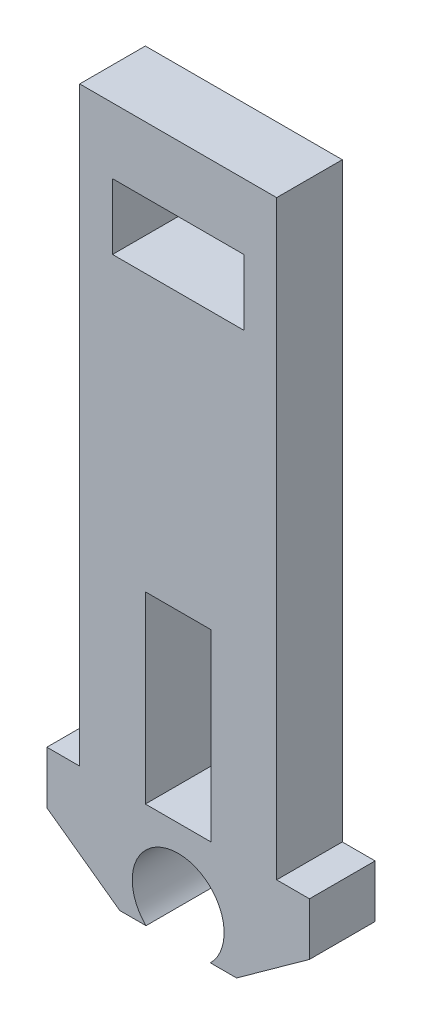
ISO-10303-21;
HEADER;
FILE_DESCRIPTION(('STEP AP214'),'2;1');
FILE_NAME('part.step','',(''),(''),'','','');
FILE_SCHEMA(('AUTOMOTIVE_DESIGN { 1 0 10303 214 1 1 1 1 }'));
ENDSEC;
DATA;
#1=APPLICATION_CONTEXT('core data for automotive mechanical design processes');
#2=APPLICATION_PROTOCOL_DEFINITION('international standard','automotive_design',2000,#1);
#3=PRODUCT_CONTEXT('',#1,'mechanical');
#4=PRODUCT('Part','Part','',(#3));
#5=PRODUCT_RELATED_PRODUCT_CATEGORY('part','',(#4));
#6=PRODUCT_DEFINITION_FORMATION('','',#4);
#7=PRODUCT_DEFINITION_CONTEXT('part definition',#1,'design');
#8=PRODUCT_DEFINITION('design','',#6,#7);
#9=PRODUCT_DEFINITION_SHAPE('','',#8);
#10=(LENGTH_UNIT() NAMED_UNIT(*) SI_UNIT(.MILLI.,.METRE.));
#11=(NAMED_UNIT(*) PLANE_ANGLE_UNIT() SI_UNIT($,.RADIAN.));
#12=(NAMED_UNIT(*) SI_UNIT($,.STERADIAN.) SOLID_ANGLE_UNIT());
#13=UNCERTAINTY_MEASURE_WITH_UNIT(LENGTH_MEASURE(1.E-05),#10,'distance_accuracy_value','');
#14=(GEOMETRIC_REPRESENTATION_CONTEXT(3) GLOBAL_UNCERTAINTY_ASSIGNED_CONTEXT((#13)) GLOBAL_UNIT_ASSIGNED_CONTEXT((#10,
#11,#12)) REPRESENTATION_CONTEXT('',''));
#15=CARTESIAN_POINT('',(0.,0.,0.));
#16=DIRECTION('',(0.,0.,1.));
#17=DIRECTION('',(1.,0.,0.));
#18=AXIS2_PLACEMENT_3D('',#15,#16,#17);
#19=CARTESIAN_POINT('',(9.44948974278318,2.5,5.));
#20=DIRECTION('',(0.,0.,1.));
#21=DIRECTION('',(1.,0.,0.));
#22=AXIS2_PLACEMENT_3D('',#19,#20,#21);
#23=PLANE('',#22);
#24=CARTESIAN_POINT('',(9.44948974278318,2.5,5.));
#25=DIRECTION('',(0.,0.,-1.));
#26=DIRECTION('',(1.,0.,0.));
#27=AXIS2_PLACEMENT_3D('',#24,#25,#26);
#28=CIRCLE('',#27,3.5);
#29=CARTESIAN_POINT('',(7.,0.,5.));
#30=VERTEX_POINT('',#29);
#31=CARTESIAN_POINT('',(11.8989794855664,0.,5.));
#32=VERTEX_POINT('',#31);
#33=EDGE_CURVE('E239',#30,#32,#28,.T.);
#34=ORIENTED_EDGE('',*,*,#33,.T.);
#35=DIRECTION('',(1.,0.,0.));
#36=VECTOR('',#35,1.);
#37=CARTESIAN_POINT('',(11.8989794855664,0.,5.));
#38=LINE('',#37,#36);
#39=CARTESIAN_POINT('',(13.8989794855664,0.,5.));
#40=VERTEX_POINT('',#39);
#41=EDGE_CURVE('E242',#32,#40,#38,.T.);
#42=ORIENTED_EDGE('',*,*,#41,.T.);
#43=DIRECTION('',(0.811282495612526,0.584654352855353,0.));
#44=VECTOR('',#43,1.);
#45=CARTESIAN_POINT('',(13.8989794855664,0.,5.));
#46=LINE('',#45,#44);
#47=CARTESIAN_POINT('',(19.4494897427832,4.,5.));
#48=VERTEX_POINT('',#47);
#49=EDGE_CURVE('E245',#40,#48,#46,.T.);
#50=ORIENTED_EDGE('',*,*,#49,.T.);
#51=DIRECTION('',(0.,1.,0.));
#52=VECTOR('',#51,1.);
#53=CARTESIAN_POINT('',(19.4494897427832,4.,5.));
#54=LINE('',#53,#52);
#55=CARTESIAN_POINT('',(19.4494897427832,7.99999999999999,5.));
#56=VERTEX_POINT('',#55);
#57=EDGE_CURVE('E247',#48,#56,#54,.T.);
#58=ORIENTED_EDGE('',*,*,#57,.T.);
#59=DIRECTION('',(-1.,0.,0.));
#60=VECTOR('',#59,1.);
#61=CARTESIAN_POINT('',(16.9494897427832,7.99999999999999,5.));
#62=LINE('',#61,#60);
#63=CARTESIAN_POINT('',(16.9494897427832,7.99999999999999,5.));
#64=VERTEX_POINT('',#63);
#65=EDGE_CURVE('E249',#56,#64,#62,.T.);
#66=ORIENTED_EDGE('',*,*,#65,.T.);
#67=DIRECTION('',(0.,1.,0.));
#68=VECTOR('',#67,1.);
#69=CARTESIAN_POINT('',(16.9494897427832,7.99999999999999,5.));
#70=LINE('',#69,#68);
#71=CARTESIAN_POINT('',(16.9494897427832,53.,5.));
#72=VERTEX_POINT('',#71);
#73=EDGE_CURVE('E251',#64,#72,#70,.T.);
#74=ORIENTED_EDGE('',*,*,#73,.T.);
#75=DIRECTION('',(-1.,0.,0.));
#76=VECTOR('',#75,1.);
#77=CARTESIAN_POINT('',(1.94948974278318,53.,5.));
#78=LINE('',#77,#76);
#79=CARTESIAN_POINT('',(1.94948974278318,53.,5.));
#80=VERTEX_POINT('',#79);
#81=EDGE_CURVE('E253',#72,#80,#78,.T.);
#82=ORIENTED_EDGE('',*,*,#81,.T.);
#83=DIRECTION('',(0.,-1.,0.));
#84=VECTOR('',#83,1.);
#85=CARTESIAN_POINT('',(1.94948974278318,7.99999999999999,5.));
#86=LINE('',#85,#84);
#87=CARTESIAN_POINT('',(1.94948974278318,7.99999999999999,5.));
#88=VERTEX_POINT('',#87);
#89=EDGE_CURVE('E255',#80,#88,#86,.T.);
#90=ORIENTED_EDGE('',*,*,#89,.T.);
#91=DIRECTION('',(-1.,0.,0.));
#92=VECTOR('',#91,1.);
#93=CARTESIAN_POINT('',(-0.550510257216824,7.99999999999999,5.));
#94=LINE('',#93,#92);
#95=CARTESIAN_POINT('',(-0.550510257216824,7.99999999999999,5.));
#96=VERTEX_POINT('',#95);
#97=EDGE_CURVE('E257',#88,#96,#94,.T.);
#98=ORIENTED_EDGE('',*,*,#97,.T.);
#99=DIRECTION('',(0.,-1.,0.));
#100=VECTOR('',#99,1.);
#101=CARTESIAN_POINT('',(-0.550510257216824,4.,5.));
#102=LINE('',#101,#100);
#103=CARTESIAN_POINT('',(-0.550510257216824,4.,5.));
#104=VERTEX_POINT('',#103);
#105=EDGE_CURVE('E259',#96,#104,#102,.T.);
#106=ORIENTED_EDGE('',*,*,#105,.T.);
#107=DIRECTION('',(0.811282495612526,-0.584654352855353,0.));
#108=VECTOR('',#107,1.);
#109=CARTESIAN_POINT('',(5.,0.,5.));
#110=LINE('',#109,#108);
#111=CARTESIAN_POINT('',(5.,0.,5.));
#112=VERTEX_POINT('',#111);
#113=EDGE_CURVE('E261',#104,#112,#110,.T.);
#114=ORIENTED_EDGE('',*,*,#113,.T.);
#115=DIRECTION('',(1.,0.,0.));
#116=VECTOR('',#115,1.);
#117=CARTESIAN_POINT('',(5.,0.,5.));
#118=LINE('',#117,#116);
#119=EDGE_CURVE('E263',#112,#30,#118,.T.);
#120=ORIENTED_EDGE('',*,*,#119,.T.);
#121=EDGE_LOOP('',(#34,#42,#50,#58,#66,#74,#82,#90,#98,#106,#114,#120));
#122=FACE_BOUND('',#121,.T.);
#123=DIRECTION('',(1.,0.,0.));
#124=VECTOR('',#123,1.);
#125=CARTESIAN_POINT('',(4.44948974278318,43.,5.));
#126=LINE('',#125,#124);
#127=CARTESIAN_POINT('',(4.44948974278318,43.,5.));
#128=VERTEX_POINT('',#127);
#129=CARTESIAN_POINT('',(14.4494897427832,43.,5.));
#130=VERTEX_POINT('',#129);
#131=EDGE_CURVE('E210',#128,#130,#126,.T.);
#132=ORIENTED_EDGE('',*,*,#131,.F.);
#133=DIRECTION('',(0.,-1.,0.));
#134=VECTOR('',#133,1.);
#135=CARTESIAN_POINT('',(4.44948974278318,48.,5.));
#136=LINE('',#135,#134);
#137=CARTESIAN_POINT('',(4.44948974278318,48.,5.));
#138=VERTEX_POINT('',#137);
#139=EDGE_CURVE('E208',#138,#128,#136,.T.);
#140=ORIENTED_EDGE('',*,*,#139,.F.);
#141=DIRECTION('',(-1.,0.,0.));
#142=VECTOR('',#141,1.);
#143=CARTESIAN_POINT('',(4.44948974278318,48.,5.));
#144=LINE('',#143,#142);
#145=CARTESIAN_POINT('',(14.4494897427832,48.,5.));
#146=VERTEX_POINT('',#145);
#147=EDGE_CURVE('E216',#146,#138,#144,.T.);
#148=ORIENTED_EDGE('',*,*,#147,.F.);
#149=DIRECTION('',(0.,1.,0.));
#150=VECTOR('',#149,1.);
#151=CARTESIAN_POINT('',(14.4494897427832,48.,5.));
#152=LINE('',#151,#150);
#153=EDGE_CURVE('E213',#130,#146,#152,.T.);
#154=ORIENTED_EDGE('',*,*,#153,.F.);
#155=EDGE_LOOP('',(#132,#140,#148,#154));
#156=FACE_BOUND('',#155,.T.);
#157=DIRECTION('',(1.,0.,0.));
#158=VECTOR('',#157,1.);
#159=CARTESIAN_POINT('',(6.94948974278318,7.99999999999999,5.));
#160=LINE('',#159,#158);
#161=CARTESIAN_POINT('',(6.94948974278318,7.99999999999999,5.));
#162=VERTEX_POINT('',#161);
#163=CARTESIAN_POINT('',(11.9494897427832,7.99999999999999,5.));
#164=VERTEX_POINT('',#163);
#165=EDGE_CURVE('E180',#162,#164,#160,.T.);
#166=ORIENTED_EDGE('',*,*,#165,.F.);
#167=DIRECTION('',(0.,-1.,0.));
#168=VECTOR('',#167,1.);
#169=CARTESIAN_POINT('',(6.94948974278318,22.,5.));
#170=LINE('',#169,#168);
#171=CARTESIAN_POINT('',(6.94948974278318,22.,5.));
#172=VERTEX_POINT('',#171);
#173=EDGE_CURVE('E172',#172,#162,#170,.T.);
#174=ORIENTED_EDGE('',*,*,#173,.F.);
#175=DIRECTION('',(-1.,0.,0.));
#176=VECTOR('',#175,1.);
#177=CARTESIAN_POINT('',(11.9494897427832,22.,5.));
#178=LINE('',#177,#176);
#179=CARTESIAN_POINT('',(11.9494897427832,22.,5.));
#180=VERTEX_POINT('',#179);
#181=EDGE_CURVE('E194',#180,#172,#178,.T.);
#182=ORIENTED_EDGE('',*,*,#181,.F.);
#183=DIRECTION('',(0.,1.,0.));
#184=VECTOR('',#183,1.);
#185=CARTESIAN_POINT('',(11.9494897427832,7.99999999999999,5.));
#186=LINE('',#185,#184);
#187=EDGE_CURVE('E192',#164,#180,#186,.T.);
#188=ORIENTED_EDGE('',*,*,#187,.F.);
#189=EDGE_LOOP('',(#166,#174,#182,#188));
#190=FACE_BOUND('',#189,.T.);
#191=ADVANCED_FACE('F35',(#122,#156,#190),#23,.T.);
#192=CARTESIAN_POINT('',(9.44948974278318,2.5,0.));
#193=DIRECTION('',(0.,0.,1.));
#194=DIRECTION('',(1.,0.,0.));
#195=AXIS2_PLACEMENT_3D('',#192,#193,#194);
#196=PLANE('',#195);
#197=DIRECTION('',(0.,-1.,0.));
#198=VECTOR('',#197,1.);
#199=CARTESIAN_POINT('',(4.44948974278318,48.,0.));
#200=LINE('',#199,#198);
#201=CARTESIAN_POINT('',(4.44948974278318,48.,0.));
#202=VERTEX_POINT('',#201);
#203=CARTESIAN_POINT('',(4.44948974278318,43.,0.));
#204=VERTEX_POINT('',#203);
#205=EDGE_CURVE('E188',#202,#204,#200,.T.);
#206=ORIENTED_EDGE('',*,*,#205,.T.);
#207=DIRECTION('',(1.,0.,0.));
#208=VECTOR('',#207,1.);
#209=CARTESIAN_POINT('',(4.44948974278318,43.,0.));
#210=LINE('',#209,#208);
#211=CARTESIAN_POINT('',(14.4494897427832,43.,0.));
#212=VERTEX_POINT('',#211);
#213=EDGE_CURVE('E221',#204,#212,#210,.T.);
#214=ORIENTED_EDGE('',*,*,#213,.T.);
#215=DIRECTION('',(0.,1.,0.));
#216=VECTOR('',#215,1.);
#217=CARTESIAN_POINT('',(14.4494897427832,48.,0.));
#218=LINE('',#217,#216);
#219=CARTESIAN_POINT('',(14.4494897427832,48.,0.));
#220=VERTEX_POINT('',#219);
#221=EDGE_CURVE('E224',#212,#220,#218,.T.);
#222=ORIENTED_EDGE('',*,*,#221,.T.);
#223=DIRECTION('',(-1.,0.,0.));
#224=VECTOR('',#223,1.);
#225=CARTESIAN_POINT('',(4.44948974278318,48.,0.));
#226=LINE('',#225,#224);
#227=EDGE_CURVE('E211',#220,#202,#226,.T.);
#228=ORIENTED_EDGE('',*,*,#227,.T.);
#229=EDGE_LOOP('',(#206,#214,#222,#228));
#230=FACE_BOUND('',#229,.T.);
#231=CARTESIAN_POINT('',(9.44948974278318,2.5,0.));
#232=DIRECTION('',(0.,0.,-1.));
#233=DIRECTION('',(1.,0.,0.));
#234=AXIS2_PLACEMENT_3D('',#231,#232,#233);
#235=CIRCLE('',#234,3.5);
#236=CARTESIAN_POINT('',(7.,0.,0.));
#237=VERTEX_POINT('',#236);
#238=CARTESIAN_POINT('',(11.8989794855664,0.,0.));
#239=VERTEX_POINT('',#238);
#240=EDGE_CURVE('E238',#237,#239,#235,.T.);
#241=ORIENTED_EDGE('',*,*,#240,.F.);
#242=DIRECTION('',(1.,0.,0.));
#243=VECTOR('',#242,1.);
#244=CARTESIAN_POINT('',(5.,0.,0.));
#245=LINE('',#244,#243);
#246=CARTESIAN_POINT('',(5.,0.,0.));
#247=VERTEX_POINT('',#246);
#248=EDGE_CURVE('E243',#247,#237,#245,.T.);
#249=ORIENTED_EDGE('',*,*,#248,.F.);
#250=DIRECTION('',(0.811282495612526,-0.584654352855353,0.));
#251=VECTOR('',#250,1.);
#252=CARTESIAN_POINT('',(5.,0.,0.));
#253=LINE('',#252,#251);
#254=CARTESIAN_POINT('',(-0.550510257216824,4.,0.));
#255=VERTEX_POINT('',#254);
#256=EDGE_CURVE('E286',#255,#247,#253,.T.);
#257=ORIENTED_EDGE('',*,*,#256,.F.);
#258=DIRECTION('',(0.,-1.,0.));
#259=VECTOR('',#258,1.);
#260=CARTESIAN_POINT('',(-0.550510257216824,4.,0.));
#261=LINE('',#260,#259);
#262=CARTESIAN_POINT('',(-0.550510257216824,7.99999999999999,0.));
#263=VERTEX_POINT('',#262);
#264=EDGE_CURVE('E284',#263,#255,#261,.T.);
#265=ORIENTED_EDGE('',*,*,#264,.F.);
#266=DIRECTION('',(-1.,0.,0.));
#267=VECTOR('',#266,1.);
#268=CARTESIAN_POINT('',(-0.550510257216824,7.99999999999999,0.));
#269=LINE('',#268,#267);
#270=CARTESIAN_POINT('',(1.94948974278318,7.99999999999999,0.));
#271=VERTEX_POINT('',#270);
#272=EDGE_CURVE('E282',#271,#263,#269,.T.);
#273=ORIENTED_EDGE('',*,*,#272,.F.);
#274=DIRECTION('',(0.,-1.,0.));
#275=VECTOR('',#274,1.);
#276=CARTESIAN_POINT('',(1.94948974278318,7.99999999999999,0.));
#277=LINE('',#276,#275);
#278=CARTESIAN_POINT('',(1.94948974278318,53.,0.));
#279=VERTEX_POINT('',#278);
#280=EDGE_CURVE('E280',#279,#271,#277,.T.);
#281=ORIENTED_EDGE('',*,*,#280,.F.);
#282=DIRECTION('',(-1.,0.,0.));
#283=VECTOR('',#282,1.);
#284=CARTESIAN_POINT('',(1.94948974278318,53.,0.));
#285=LINE('',#284,#283);
#286=CARTESIAN_POINT('',(16.9494897427832,53.,0.));
#287=VERTEX_POINT('',#286);
#288=EDGE_CURVE('E278',#287,#279,#285,.T.);
#289=ORIENTED_EDGE('',*,*,#288,.F.);
#290=DIRECTION('',(0.,1.,0.));
#291=VECTOR('',#290,1.);
#292=CARTESIAN_POINT('',(16.9494897427832,7.99999999999999,0.));
#293=LINE('',#292,#291);
#294=CARTESIAN_POINT('',(16.9494897427832,7.99999999999999,0.));
#295=VERTEX_POINT('',#294);
#296=EDGE_CURVE('E276',#295,#287,#293,.T.);
#297=ORIENTED_EDGE('',*,*,#296,.F.);
#298=DIRECTION('',(-1.,0.,0.));
#299=VECTOR('',#298,1.);
#300=CARTESIAN_POINT('',(16.9494897427832,7.99999999999999,0.));
#301=LINE('',#300,#299);
#302=CARTESIAN_POINT('',(19.4494897427832,7.99999999999999,0.));
#303=VERTEX_POINT('',#302);
#304=EDGE_CURVE('E274',#303,#295,#301,.T.);
#305=ORIENTED_EDGE('',*,*,#304,.F.);
#306=DIRECTION('',(0.,1.,0.));
#307=VECTOR('',#306,1.);
#308=CARTESIAN_POINT('',(19.4494897427832,4.,0.));
#309=LINE('',#308,#307);
#310=CARTESIAN_POINT('',(19.4494897427832,4.,0.));
#311=VERTEX_POINT('',#310);
#312=EDGE_CURVE('E272',#311,#303,#309,.T.);
#313=ORIENTED_EDGE('',*,*,#312,.F.);
#314=DIRECTION('',(0.811282495612526,0.584654352855353,0.));
#315=VECTOR('',#314,1.);
#316=CARTESIAN_POINT('',(13.8989794855664,0.,0.));
#317=LINE('',#316,#315);
#318=CARTESIAN_POINT('',(13.8989794855664,0.,0.));
#319=VERTEX_POINT('',#318);
#320=EDGE_CURVE('E270',#319,#311,#317,.T.);
#321=ORIENTED_EDGE('',*,*,#320,.F.);
#322=DIRECTION('',(1.,0.,0.));
#323=VECTOR('',#322,1.);
#324=CARTESIAN_POINT('',(11.8989794855664,0.,0.));
#325=LINE('',#324,#323);
#326=EDGE_CURVE('E268',#239,#319,#325,.T.);
#327=ORIENTED_EDGE('',*,*,#326,.F.);
#328=EDGE_LOOP('',(#241,#249,#257,#265,#273,#281,#289,#297,#305,#313,#321,#327));
#329=FACE_BOUND('',#328,.T.);
#330=DIRECTION('',(0.,-1.,0.));
#331=VECTOR('',#330,1.);
#332=CARTESIAN_POINT('',(6.94948974278318,22.,0.));
#333=LINE('',#332,#331);
#334=CARTESIAN_POINT('',(6.94948974278318,22.,0.));
#335=VERTEX_POINT('',#334);
#336=CARTESIAN_POINT('',(6.94948974278318,7.99999999999999,0.));
#337=VERTEX_POINT('',#336);
#338=EDGE_CURVE('E58',#335,#337,#333,.T.);
#339=ORIENTED_EDGE('',*,*,#338,.T.);
#340=DIRECTION('',(1.,0.,0.));
#341=VECTOR('',#340,1.);
#342=CARTESIAN_POINT('',(6.94948974278318,7.99999999999999,0.));
#343=LINE('',#342,#341);
#344=CARTESIAN_POINT('',(11.9494897427832,7.99999999999999,0.));
#345=VERTEX_POINT('',#344);
#346=EDGE_CURVE('E187',#337,#345,#343,.T.);
#347=ORIENTED_EDGE('',*,*,#346,.T.);
#348=DIRECTION('',(0.,1.,0.));
#349=VECTOR('',#348,1.);
#350=CARTESIAN_POINT('',(11.9494897427832,7.99999999999999,0.));
#351=LINE('',#350,#349);
#352=CARTESIAN_POINT('',(11.9494897427832,22.,0.));
#353=VERTEX_POINT('',#352);
#354=EDGE_CURVE('E200',#345,#353,#351,.T.);
#355=ORIENTED_EDGE('',*,*,#354,.T.);
#356=DIRECTION('',(-1.,0.,0.));
#357=VECTOR('',#356,1.);
#358=CARTESIAN_POINT('',(11.9494897427832,22.,0.));
#359=LINE('',#358,#357);
#360=EDGE_CURVE('E181',#353,#335,#359,.T.);
#361=ORIENTED_EDGE('',*,*,#360,.T.);
#362=EDGE_LOOP('',(#339,#347,#355,#361));
#363=FACE_BOUND('',#362,.T.);
#364=ADVANCED_FACE('F328',(#230,#329,#363),#196,.F.);
#365=CARTESIAN_POINT('',(9.44948974278318,2.5,5.));
#366=DIRECTION('',(0.,0.,-1.));
#367=DIRECTION('',(-1.,0.,0.));
#368=AXIS2_PLACEMENT_3D('',#365,#366,#367);
#369=CYLINDRICAL_SURFACE('',#368,3.5);
#370=ORIENTED_EDGE('',*,*,#240,.T.);
#371=DIRECTION('',(0.,0.,-1.));
#372=VECTOR('',#371,1.);
#373=CARTESIAN_POINT('',(11.8989794855664,0.,5.));
#374=LINE('',#373,#372);
#375=EDGE_CURVE('E11',#32,#239,#374,.T.);
#376=ORIENTED_EDGE('',*,*,#375,.F.);
#377=ORIENTED_EDGE('',*,*,#33,.F.);
#378=DIRECTION('',(0.,0.,-1.));
#379=VECTOR('',#378,1.);
#380=CARTESIAN_POINT('',(7.,0.,5.));
#381=LINE('',#380,#379);
#382=EDGE_CURVE('E265',#30,#237,#381,.T.);
#383=ORIENTED_EDGE('',*,*,#382,.T.);
#384=EDGE_LOOP('',(#370,#376,#377,#383));
#385=FACE_BOUND('',#384,.T.);
#386=ADVANCED_FACE('F37',(#385),#369,.F.);
#387=CARTESIAN_POINT('',(11.8989794855664,0.,5.));
#388=DIRECTION('',(0.,1.,0.));
#389=DIRECTION('',(-1.,0.,0.));
#390=AXIS2_PLACEMENT_3D('',#387,#388,#389);
#391=PLANE('',#390);
#392=ORIENTED_EDGE('',*,*,#326,.T.);
#393=DIRECTION('',(0.,0.,-1.));
#394=VECTOR('',#393,1.);
#395=CARTESIAN_POINT('',(13.8989794855664,0.,5.));
#396=LINE('',#395,#394);
#397=EDGE_CURVE('E43',#40,#319,#396,.T.);
#398=ORIENTED_EDGE('',*,*,#397,.F.);
#399=ORIENTED_EDGE('',*,*,#41,.F.);
#400=ORIENTED_EDGE('',*,*,#375,.T.);
#401=EDGE_LOOP('',(#392,#398,#399,#400));
#402=FACE_BOUND('',#401,.T.);
#403=ADVANCED_FACE('F346',(#402),#391,.F.);
#404=CARTESIAN_POINT('',(13.8989794855664,0.,5.));
#405=DIRECTION('',(-0.584654352855353,0.811282495612526,0.));
#406=DIRECTION('',(-0.811282495612526,-0.584654352855353,0.));
#407=AXIS2_PLACEMENT_3D('',#404,#405,#406);
#408=PLANE('',#407);
#409=ORIENTED_EDGE('',*,*,#320,.T.);
#410=DIRECTION('',(0.,0.,-1.));
#411=VECTOR('',#410,1.);
#412=CARTESIAN_POINT('',(19.4494897427832,4.,5.));
#413=LINE('',#412,#411);
#414=EDGE_CURVE('E315',#48,#311,#413,.T.);
#415=ORIENTED_EDGE('',*,*,#414,.F.);
#416=ORIENTED_EDGE('',*,*,#49,.F.);
#417=ORIENTED_EDGE('',*,*,#397,.T.);
#418=EDGE_LOOP('',(#409,#415,#416,#417));
#419=FACE_BOUND('',#418,.T.);
#420=ADVANCED_FACE('F322',(#419),#408,.F.);
#421=CARTESIAN_POINT('',(19.4494897427832,4.,5.));
#422=DIRECTION('',(-1.,0.,0.));
#423=DIRECTION('',(0.,0.,1.));
#424=AXIS2_PLACEMENT_3D('',#421,#422,#423);
#425=PLANE('',#424);
#426=ORIENTED_EDGE('',*,*,#312,.T.);
#427=DIRECTION('',(0.,0.,-1.));
#428=VECTOR('',#427,1.);
#429=CARTESIAN_POINT('',(19.4494897427832,7.99999999999999,5.));
#430=LINE('',#429,#428);
#431=EDGE_CURVE('E312',#56,#303,#430,.T.);
#432=ORIENTED_EDGE('',*,*,#431,.F.);
#433=ORIENTED_EDGE('',*,*,#57,.F.);
#434=ORIENTED_EDGE('',*,*,#414,.T.);
#435=EDGE_LOOP('',(#426,#432,#433,#434));
#436=FACE_BOUND('',#435,.T.);
#437=ADVANCED_FACE('F334',(#436),#425,.F.);
#438=CARTESIAN_POINT('',(16.9494897427832,7.99999999999999,5.));
#439=DIRECTION('',(0.,-1.,0.));
#440=DIRECTION('',(0.,0.,-1.));
#441=AXIS2_PLACEMENT_3D('',#438,#439,#440);
#442=PLANE('',#441);
#443=ORIENTED_EDGE('',*,*,#304,.T.);
#444=DIRECTION('',(0.,0.,-1.));
#445=VECTOR('',#444,1.);
#446=CARTESIAN_POINT('',(16.9494897427832,7.99999999999999,5.));
#447=LINE('',#446,#445);
#448=EDGE_CURVE('E309',#64,#295,#447,.T.);
#449=ORIENTED_EDGE('',*,*,#448,.F.);
#450=ORIENTED_EDGE('',*,*,#65,.F.);
#451=ORIENTED_EDGE('',*,*,#431,.T.);
#452=EDGE_LOOP('',(#443,#449,#450,#451));
#453=FACE_BOUND('',#452,.T.);
#454=ADVANCED_FACE('F338',(#453),#442,.F.);
#455=CARTESIAN_POINT('',(16.9494897427832,7.99999999999999,5.));
#456=DIRECTION('',(-1.,0.,0.));
#457=DIRECTION('',(0.,0.,1.));
#458=AXIS2_PLACEMENT_3D('',#455,#456,#457);
#459=PLANE('',#458);
#460=ORIENTED_EDGE('',*,*,#296,.T.);
#461=DIRECTION('',(0.,0.,-1.));
#462=VECTOR('',#461,1.);
#463=CARTESIAN_POINT('',(16.9494897427832,53.,5.));
#464=LINE('',#463,#462);
#465=EDGE_CURVE('E306',#72,#287,#464,.T.);
#466=ORIENTED_EDGE('',*,*,#465,.F.);
#467=ORIENTED_EDGE('',*,*,#73,.F.);
#468=ORIENTED_EDGE('',*,*,#448,.T.);
#469=EDGE_LOOP('',(#460,#466,#467,#468));
#470=FACE_BOUND('',#469,.T.);
#471=ADVANCED_FACE('F379',(#470),#459,.F.);
#472=CARTESIAN_POINT('',(1.94948974278318,53.,5.));
#473=DIRECTION('',(0.,-1.,0.));
#474=DIRECTION('',(0.,0.,-1.));
#475=AXIS2_PLACEMENT_3D('',#472,#473,#474);
#476=PLANE('',#475);
#477=ORIENTED_EDGE('',*,*,#288,.T.);
#478=DIRECTION('',(0.,0.,-1.));
#479=VECTOR('',#478,1.);
#480=CARTESIAN_POINT('',(1.94948974278318,53.,5.));
#481=LINE('',#480,#479);
#482=EDGE_CURVE('E303',#80,#279,#481,.T.);
#483=ORIENTED_EDGE('',*,*,#482,.F.);
#484=ORIENTED_EDGE('',*,*,#81,.F.);
#485=ORIENTED_EDGE('',*,*,#465,.T.);
#486=EDGE_LOOP('',(#477,#483,#484,#485));
#487=FACE_BOUND('',#486,.T.);
#488=ADVANCED_FACE('F377',(#487),#476,.F.);
#489=CARTESIAN_POINT('',(1.94948974278318,7.99999999999999,5.));
#490=DIRECTION('',(1.,0.,0.));
#491=DIRECTION('',(0.,0.,-1.));
#492=AXIS2_PLACEMENT_3D('',#489,#490,#491);
#493=PLANE('',#492);
#494=ORIENTED_EDGE('',*,*,#280,.T.);
#495=DIRECTION('',(0.,0.,-1.));
#496=VECTOR('',#495,1.);
#497=CARTESIAN_POINT('',(1.94948974278318,7.99999999999999,5.));
#498=LINE('',#497,#496);
#499=EDGE_CURVE('E300',#88,#271,#498,.T.);
#500=ORIENTED_EDGE('',*,*,#499,.F.);
#501=ORIENTED_EDGE('',*,*,#89,.F.);
#502=ORIENTED_EDGE('',*,*,#482,.T.);
#503=EDGE_LOOP('',(#494,#500,#501,#502));
#504=FACE_BOUND('',#503,.T.);
#505=ADVANCED_FACE('F373',(#504),#493,.F.);
#506=CARTESIAN_POINT('',(-0.550510257216824,7.99999999999999,5.));
#507=DIRECTION('',(0.,-1.,0.));
#508=DIRECTION('',(0.,0.,-1.));
#509=AXIS2_PLACEMENT_3D('',#506,#507,#508);
#510=PLANE('',#509);
#511=ORIENTED_EDGE('',*,*,#272,.T.);
#512=DIRECTION('',(0.,0.,-1.));
#513=VECTOR('',#512,1.);
#514=CARTESIAN_POINT('',(-0.550510257216824,7.99999999999999,5.));
#515=LINE('',#514,#513);
#516=EDGE_CURVE('E297',#96,#263,#515,.T.);
#517=ORIENTED_EDGE('',*,*,#516,.F.);
#518=ORIENTED_EDGE('',*,*,#97,.F.);
#519=ORIENTED_EDGE('',*,*,#499,.T.);
#520=EDGE_LOOP('',(#511,#517,#518,#519));
#521=FACE_BOUND('',#520,.T.);
#522=ADVANCED_FACE('F368',(#521),#510,.F.);
#523=CARTESIAN_POINT('',(-0.550510257216824,4.,5.));
#524=DIRECTION('',(1.,0.,0.));
#525=DIRECTION('',(0.,0.,-1.));
#526=AXIS2_PLACEMENT_3D('',#523,#524,#525);
#527=PLANE('',#526);
#528=ORIENTED_EDGE('',*,*,#264,.T.);
#529=DIRECTION('',(0.,0.,-1.));
#530=VECTOR('',#529,1.);
#531=CARTESIAN_POINT('',(-0.550510257216824,4.,5.));
#532=LINE('',#531,#530);
#533=EDGE_CURVE('E294',#104,#255,#532,.T.);
#534=ORIENTED_EDGE('',*,*,#533,.F.);
#535=ORIENTED_EDGE('',*,*,#105,.F.);
#536=ORIENTED_EDGE('',*,*,#516,.T.);
#537=EDGE_LOOP('',(#528,#534,#535,#536));
#538=FACE_BOUND('',#537,.T.);
#539=ADVANCED_FACE('F362',(#538),#527,.F.);
#540=CARTESIAN_POINT('',(5.,0.,5.));
#541=DIRECTION('',(0.584654352855353,0.811282495612526,0.));
#542=DIRECTION('',(-0.811282495612526,0.584654352855353,0.));
#543=AXIS2_PLACEMENT_3D('',#540,#541,#542);
#544=PLANE('',#543);
#545=ORIENTED_EDGE('',*,*,#256,.T.);
#546=DIRECTION('',(0.,0.,-1.));
#547=VECTOR('',#546,1.);
#548=CARTESIAN_POINT('',(5.,0.,5.));
#549=LINE('',#548,#547);
#550=EDGE_CURVE('E291',#112,#247,#549,.T.);
#551=ORIENTED_EDGE('',*,*,#550,.F.);
#552=ORIENTED_EDGE('',*,*,#113,.F.);
#553=ORIENTED_EDGE('',*,*,#533,.T.);
#554=EDGE_LOOP('',(#545,#551,#552,#553));
#555=FACE_BOUND('',#554,.T.);
#556=ADVANCED_FACE('F358',(#555),#544,.F.);
#557=CARTESIAN_POINT('',(5.,0.,5.));
#558=DIRECTION('',(0.,1.,0.));
#559=DIRECTION('',(-1.,0.,0.));
#560=AXIS2_PLACEMENT_3D('',#557,#558,#559);
#561=PLANE('',#560);
#562=ORIENTED_EDGE('',*,*,#248,.T.);
#563=ORIENTED_EDGE('',*,*,#382,.F.);
#564=ORIENTED_EDGE('',*,*,#119,.F.);
#565=ORIENTED_EDGE('',*,*,#550,.T.);
#566=EDGE_LOOP('',(#562,#563,#564,#565));
#567=FACE_BOUND('',#566,.T.);
#568=ADVANCED_FACE('F353',(#567),#561,.F.);
#569=CARTESIAN_POINT('',(4.44948974278318,48.,5.));
#570=DIRECTION('',(1.,0.,0.));
#571=DIRECTION('',(0.,1.,0.));
#572=AXIS2_PLACEMENT_3D('',#569,#570,#571);
#573=PLANE('',#572);
#574=ORIENTED_EDGE('',*,*,#205,.F.);
#575=DIRECTION('',(0.,0.,-1.));
#576=VECTOR('',#575,1.);
#577=CARTESIAN_POINT('',(4.44948974278318,48.,5.));
#578=LINE('',#577,#576);
#579=EDGE_CURVE('E218',#138,#202,#578,.T.);
#580=ORIENTED_EDGE('',*,*,#579,.F.);
#581=ORIENTED_EDGE('',*,*,#139,.T.);
#582=DIRECTION('',(0.,0.,-1.));
#583=VECTOR('',#582,1.);
#584=CARTESIAN_POINT('',(4.44948974278318,43.,5.));
#585=LINE('',#584,#583);
#586=EDGE_CURVE('E235',#128,#204,#585,.T.);
#587=ORIENTED_EDGE('',*,*,#586,.T.);
#588=EDGE_LOOP('',(#574,#580,#581,#587));
#589=FACE_BOUND('',#588,.T.);
#590=ADVANCED_FACE('F396',(#589),#573,.T.);
#591=CARTESIAN_POINT('',(4.44948974278318,43.,5.));
#592=DIRECTION('',(0.,1.,0.));
#593=DIRECTION('',(0.,0.,1.));
#594=AXIS2_PLACEMENT_3D('',#591,#592,#593);
#595=PLANE('',#594);
#596=ORIENTED_EDGE('',*,*,#213,.F.);
#597=ORIENTED_EDGE('',*,*,#586,.F.);
#598=ORIENTED_EDGE('',*,*,#131,.T.);
#599=DIRECTION('',(0.,0.,-1.));
#600=VECTOR('',#599,1.);
#601=CARTESIAN_POINT('',(14.4494897427832,43.,5.));
#602=LINE('',#601,#600);
#603=EDGE_CURVE('E233',#130,#212,#602,.T.);
#604=ORIENTED_EDGE('',*,*,#603,.T.);
#605=EDGE_LOOP('',(#596,#597,#598,#604));
#606=FACE_BOUND('',#605,.T.);
#607=ADVANCED_FACE('F434',(#606),#595,.T.);
#608=CARTESIAN_POINT('',(14.4494897427832,48.,5.));
#609=DIRECTION('',(-1.,0.,0.));
#610=DIRECTION('',(0.,-1.,0.));
#611=AXIS2_PLACEMENT_3D('',#608,#609,#610);
#612=PLANE('',#611);
#613=ORIENTED_EDGE('',*,*,#221,.F.);
#614=ORIENTED_EDGE('',*,*,#603,.F.);
#615=ORIENTED_EDGE('',*,*,#153,.T.);
#616=DIRECTION('',(0.,0.,-1.));
#617=VECTOR('',#616,1.);
#618=CARTESIAN_POINT('',(14.4494897427832,48.,5.));
#619=LINE('',#618,#617);
#620=EDGE_CURVE('E231',#146,#220,#619,.T.);
#621=ORIENTED_EDGE('',*,*,#620,.T.);
#622=EDGE_LOOP('',(#613,#614,#615,#621));
#623=FACE_BOUND('',#622,.T.);
#624=ADVANCED_FACE('F441',(#623),#612,.T.);
#625=CARTESIAN_POINT('',(4.44948974278318,48.,5.));
#626=DIRECTION('',(0.,-1.,0.));
#627=DIRECTION('',(0.,0.,-1.));
#628=AXIS2_PLACEMENT_3D('',#625,#626,#627);
#629=PLANE('',#628);
#630=ORIENTED_EDGE('',*,*,#227,.F.);
#631=ORIENTED_EDGE('',*,*,#620,.F.);
#632=ORIENTED_EDGE('',*,*,#147,.T.);
#633=ORIENTED_EDGE('',*,*,#579,.T.);
#634=EDGE_LOOP('',(#630,#631,#632,#633));
#635=FACE_BOUND('',#634,.T.);
#636=ADVANCED_FACE('F448',(#635),#629,.T.);
#637=CARTESIAN_POINT('',(6.94948974278318,22.,5.));
#638=DIRECTION('',(1.,0.,0.));
#639=DIRECTION('',(0.,1.,0.));
#640=AXIS2_PLACEMENT_3D('',#637,#638,#639);
#641=PLANE('',#640);
#642=ORIENTED_EDGE('',*,*,#338,.F.);
#643=DIRECTION('',(0.,0.,-1.));
#644=VECTOR('',#643,1.);
#645=CARTESIAN_POINT('',(6.94948974278318,22.,5.));
#646=LINE('',#645,#644);
#647=EDGE_CURVE('E176',#172,#335,#646,.T.);
#648=ORIENTED_EDGE('',*,*,#647,.F.);
#649=ORIENTED_EDGE('',*,*,#173,.T.);
#650=DIRECTION('',(0.,0.,-1.));
#651=VECTOR('',#650,1.);
#652=CARTESIAN_POINT('',(6.94948974278318,7.99999999999999,5.));
#653=LINE('',#652,#651);
#654=EDGE_CURVE('E175',#162,#337,#653,.T.);
#655=ORIENTED_EDGE('',*,*,#654,.T.);
#656=EDGE_LOOP('',(#642,#648,#649,#655));
#657=FACE_BOUND('',#656,.T.);
#658=ADVANCED_FACE('F174',(#657),#641,.T.);
#659=CARTESIAN_POINT('',(6.94948974278318,7.99999999999999,5.));
#660=DIRECTION('',(0.,1.,0.));
#661=DIRECTION('',(0.,0.,1.));
#662=AXIS2_PLACEMENT_3D('',#659,#660,#661);
#663=PLANE('',#662);
#664=ORIENTED_EDGE('',*,*,#346,.F.);
#665=ORIENTED_EDGE('',*,*,#654,.F.);
#666=ORIENTED_EDGE('',*,*,#165,.T.);
#667=DIRECTION('',(0.,0.,-1.));
#668=VECTOR('',#667,1.);
#669=CARTESIAN_POINT('',(11.9494897427832,7.99999999999999,5.));
#670=LINE('',#669,#668);
#671=EDGE_CURVE('E189',#164,#345,#670,.T.);
#672=ORIENTED_EDGE('',*,*,#671,.T.);
#673=EDGE_LOOP('',(#664,#665,#666,#672));
#674=FACE_BOUND('',#673,.T.);
#675=ADVANCED_FACE('F184',(#674),#663,.T.);
#676=CARTESIAN_POINT('',(11.9494897427832,7.99999999999999,5.));
#677=DIRECTION('',(-1.,0.,0.));
#678=DIRECTION('',(0.,-1.,0.));
#679=AXIS2_PLACEMENT_3D('',#676,#677,#678);
#680=PLANE('',#679);
#681=ORIENTED_EDGE('',*,*,#354,.F.);
#682=ORIENTED_EDGE('',*,*,#671,.F.);
#683=ORIENTED_EDGE('',*,*,#187,.T.);
#684=DIRECTION('',(0.,0.,-1.));
#685=VECTOR('',#684,1.);
#686=CARTESIAN_POINT('',(11.9494897427832,22.,5.));
#687=LINE('',#686,#685);
#688=EDGE_CURVE('E50',#180,#353,#687,.T.);
#689=ORIENTED_EDGE('',*,*,#688,.T.);
#690=EDGE_LOOP('',(#681,#682,#683,#689));
#691=FACE_BOUND('',#690,.T.);
#692=ADVANCED_FACE('F469',(#691),#680,.T.);
#693=CARTESIAN_POINT('',(11.9494897427832,22.,5.));
#694=DIRECTION('',(0.,-1.,0.));
#695=DIRECTION('',(0.,0.,-1.));
#696=AXIS2_PLACEMENT_3D('',#693,#694,#695);
#697=PLANE('',#696);
#698=ORIENTED_EDGE('',*,*,#360,.F.);
#699=ORIENTED_EDGE('',*,*,#688,.F.);
#700=ORIENTED_EDGE('',*,*,#181,.T.);
#701=ORIENTED_EDGE('',*,*,#647,.T.);
#702=EDGE_LOOP('',(#698,#699,#700,#701));
#703=FACE_BOUND('',#702,.T.);
#704=ADVANCED_FACE('F476',(#703),#697,.T.);
#705=CLOSED_SHELL('',(#191,#364,#386,#403,#420,#437,#454,#471,#488,#505,#522,#539,#556,#568,
#590,#607,#624,#636,#658,#675,#692,#704));
#706=MANIFOLD_SOLID_BREP('B2',#705);
#707=ADVANCED_BREP_SHAPE_REPRESENTATION('',(#18,#706),#14);
#708=SHAPE_DEFINITION_REPRESENTATION(#9,#707);
ENDSEC;
END-ISO-10303-21;
